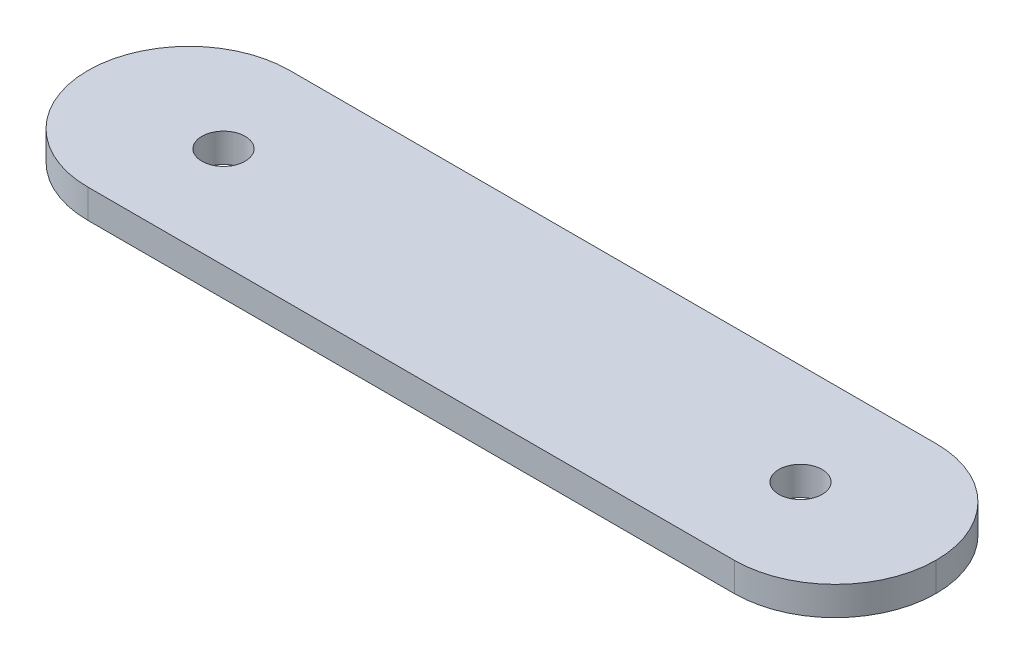
ISO-10303-21;
HEADER;
FILE_DESCRIPTION(('STEP AP214'),'2;1');
FILE_NAME('part.step','',(''),(''),'','','');
FILE_SCHEMA(('AUTOMOTIVE_DESIGN { 1 0 10303 214 1 1 1 1 }'));
ENDSEC;
DATA;
#1=APPLICATION_CONTEXT('core data for automotive mechanical design processes');
#2=APPLICATION_PROTOCOL_DEFINITION('international standard','automotive_design',2000,#1);
#3=PRODUCT_CONTEXT('',#1,'mechanical');
#4=PRODUCT('Part','Part','',(#3));
#5=PRODUCT_RELATED_PRODUCT_CATEGORY('part','',(#4));
#6=PRODUCT_DEFINITION_FORMATION('','',#4);
#7=PRODUCT_DEFINITION_CONTEXT('part definition',#1,'design');
#8=PRODUCT_DEFINITION('design','',#6,#7);
#9=PRODUCT_DEFINITION_SHAPE('','',#8);
#10=(LENGTH_UNIT() NAMED_UNIT(*) SI_UNIT(.MILLI.,.METRE.));
#11=(NAMED_UNIT(*) PLANE_ANGLE_UNIT() SI_UNIT($,.RADIAN.));
#12=(NAMED_UNIT(*) SI_UNIT($,.STERADIAN.) SOLID_ANGLE_UNIT());
#13=UNCERTAINTY_MEASURE_WITH_UNIT(LENGTH_MEASURE(1.E-05),#10,'distance_accuracy_value','');
#14=(GEOMETRIC_REPRESENTATION_CONTEXT(3) GLOBAL_UNCERTAINTY_ASSIGNED_CONTEXT((#13)) GLOBAL_UNIT_ASSIGNED_CONTEXT((#10,
#11,#12)) REPRESENTATION_CONTEXT('',''));
#15=CARTESIAN_POINT('',(0.,0.,0.));
#16=DIRECTION('',(0.,0.,1.));
#17=DIRECTION('',(1.,0.,0.));
#18=AXIS2_PLACEMENT_3D('',#15,#16,#17);
#19=CARTESIAN_POINT('',(101.316245321594,6.35,-4.00104230425884));
#20=DIRECTION('',(0.,1.,0.));
#21=DIRECTION('',(0.,0.,1.));
#22=AXIS2_PLACEMENT_3D('',#19,#20,#21);
#23=PLANE('',#22);
#24=CARTESIAN_POINT('',(-33.3291546784062,6.35,-4.02644230425883));
#25=DIRECTION('',(0.,1.,0.));
#26=DIRECTION('',(0.,0.,1.));
#27=AXIS2_PLACEMENT_3D('',#24,#25,#26);
#28=CIRCLE('',#27,4.7625);
#29=CARTESIAN_POINT('',(-33.3291546784062,6.35,0.73605769574117));
#30=VERTEX_POINT('',#29);
#31=EDGE_CURVE('E152',#30,#30,#28,.T.);
#32=ORIENTED_EDGE('',*,*,#31,.F.);
#33=EDGE_LOOP('',(#32));
#34=FACE_BOUND('',#33,.T.);
#35=CARTESIAN_POINT('',(101.316245321594,6.35,-4.00104230425884));
#36=DIRECTION('',(0.,1.,0.));
#37=DIRECTION('',(0.,0.,1.));
#38=AXIS2_PLACEMENT_3D('',#35,#36,#37);
#39=CIRCLE('',#38,22.1996);
#40=CARTESIAN_POINT('',(101.316245321594,6.35,18.1985576957412));
#41=VERTEX_POINT('',#40);
#42=CARTESIAN_POINT('',(123.515845321594,6.35,-4.001042304259));
#43=VERTEX_POINT('',#42);
#44=EDGE_CURVE('E170',#41,#43,#39,.T.);
#45=ORIENTED_EDGE('',*,*,#44,.T.);
#46=DIRECTION('',(0.,0.,-1.));
#47=VECTOR('',#46,1.);
#48=CARTESIAN_POINT('',(123.515845321594,6.35,-4.001042304259));
#49=LINE('',#48,#47);
#50=CARTESIAN_POINT('',(123.515845321594,6.35,-4.0518423042587));
#51=VERTEX_POINT('',#50);
#52=EDGE_CURVE('E106',#43,#51,#49,.T.);
#53=ORIENTED_EDGE('',*,*,#52,.T.);
#54=CARTESIAN_POINT('',(101.316245321594,6.35,-4.05184230425885));
#55=DIRECTION('',(0.,1.,0.));
#56=DIRECTION('',(0.,0.,-1.));
#57=AXIS2_PLACEMENT_3D('',#54,#55,#56);
#58=CIRCLE('',#57,22.1996);
#59=CARTESIAN_POINT('',(101.316245321594,6.35,-26.2514423042589));
#60=VERTEX_POINT('',#59);
#61=EDGE_CURVE('E191',#51,#60,#58,.T.);
#62=ORIENTED_EDGE('',*,*,#61,.T.);
#63=DIRECTION('',(-1.,0.,0.));
#64=VECTOR('',#63,1.);
#65=CARTESIAN_POINT('',(-40.974554678406,6.35,-26.2514423042589));
#66=LINE('',#65,#64);
#67=CARTESIAN_POINT('',(-40.9745546784062,6.35,-26.2514423042589));
#68=VERTEX_POINT('',#67);
#69=EDGE_CURVE('E205',#60,#68,#66,.T.);
#70=ORIENTED_EDGE('',*,*,#69,.T.);
#71=CARTESIAN_POINT('',(-40.9745546784062,6.35,-4.05184230425886));
#72=DIRECTION('',(0.,1.,0.));
#73=DIRECTION('',(0.,0.,-1.));
#74=AXIS2_PLACEMENT_3D('',#71,#72,#73);
#75=CIRCLE('',#74,22.1996);
#76=CARTESIAN_POINT('',(-63.1741546784062,6.35,-4.0518423042587));
#77=VERTEX_POINT('',#76);
#78=EDGE_CURVE('E125',#68,#77,#75,.T.);
#79=ORIENTED_EDGE('',*,*,#78,.T.);
#80=DIRECTION('',(0.,0.,1.));
#81=VECTOR('',#80,1.);
#82=CARTESIAN_POINT('',(-63.1741546784062,6.35,-4.001042304259));
#83=LINE('',#82,#81);
#84=CARTESIAN_POINT('',(-63.1741546784062,6.35,-4.00104230425899));
#85=VERTEX_POINT('',#84);
#86=EDGE_CURVE('E119',#77,#85,#83,.T.);
#87=ORIENTED_EDGE('',*,*,#86,.T.);
#88=CARTESIAN_POINT('',(-40.9745546784062,6.35,-4.00104230425884));
#89=DIRECTION('',(0.,1.,0.));
#90=DIRECTION('',(0.,0.,-1.));
#91=AXIS2_PLACEMENT_3D('',#88,#89,#90);
#92=CIRCLE('',#91,22.1996);
#93=CARTESIAN_POINT('',(-40.974554678406,6.35,18.1985576957412));
#94=VERTEX_POINT('',#93);
#95=EDGE_CURVE('E123',#85,#94,#92,.T.);
#96=ORIENTED_EDGE('',*,*,#95,.T.);
#97=DIRECTION('',(1.,0.,0.));
#98=VECTOR('',#97,1.);
#99=CARTESIAN_POINT('',(-40.974554678406,6.35,18.1985576957412));
#100=LINE('',#99,#98);
#101=EDGE_CURVE('E63',#94,#41,#100,.T.);
#102=ORIENTED_EDGE('',*,*,#101,.T.);
#103=EDGE_LOOP('',(#45,#53,#62,#70,#79,#87,#96,#102));
#104=FACE_BOUND('',#103,.T.);
#105=CARTESIAN_POINT('',(93.6708453215938,6.35,-4.02644230425885));
#106=DIRECTION('',(0.,1.,0.));
#107=DIRECTION('',(0.,0.,1.));
#108=AXIS2_PLACEMENT_3D('',#105,#106,#107);
#109=CIRCLE('',#108,4.7625);
#110=CARTESIAN_POINT('',(93.6708453215938,6.35,0.736057695741148));
#111=VERTEX_POINT('',#110);
#112=EDGE_CURVE('E219',#111,#111,#109,.T.);
#113=ORIENTED_EDGE('',*,*,#112,.F.);
#114=EDGE_LOOP('',(#113));
#115=FACE_BOUND('',#114,.T.);
#116=ADVANCED_FACE('F45',(#34,#104,#115),#23,.T.);
#117=CARTESIAN_POINT('',(101.316245321594,0.,-4.00104230425884));
#118=DIRECTION('',(0.,1.,0.));
#119=DIRECTION('',(0.,0.,1.));
#120=AXIS2_PLACEMENT_3D('',#117,#118,#119);
#121=PLANE('',#120);
#122=CARTESIAN_POINT('',(101.316245321594,0.,-4.00104230425884));
#123=DIRECTION('',(0.,1.,0.));
#124=DIRECTION('',(0.,0.,1.));
#125=AXIS2_PLACEMENT_3D('',#122,#123,#124);
#126=CIRCLE('',#125,22.1996);
#127=CARTESIAN_POINT('',(101.316245321594,0.,18.1985576957412));
#128=VERTEX_POINT('',#127);
#129=CARTESIAN_POINT('',(123.515845321594,0.,-4.001042304259));
#130=VERTEX_POINT('',#129);
#131=EDGE_CURVE('E147',#128,#130,#126,.T.);
#132=ORIENTED_EDGE('',*,*,#131,.F.);
#133=DIRECTION('',(1.,0.,0.));
#134=VECTOR('',#133,1.);
#135=CARTESIAN_POINT('',(-40.974554678406,0.,18.1985576957412));
#136=LINE('',#135,#134);
#137=CARTESIAN_POINT('',(-40.974554678406,0.,18.1985576957412));
#138=VERTEX_POINT('',#137);
#139=EDGE_CURVE('E98',#138,#128,#136,.T.);
#140=ORIENTED_EDGE('',*,*,#139,.F.);
#141=CARTESIAN_POINT('',(-40.9745546784062,0.,-4.00104230425884));
#142=DIRECTION('',(0.,1.,0.));
#143=DIRECTION('',(0.,0.,-1.));
#144=AXIS2_PLACEMENT_3D('',#141,#142,#143);
#145=CIRCLE('',#144,22.1996);
#146=CARTESIAN_POINT('',(-63.1741546784062,0.,-4.00104230425899));
#147=VERTEX_POINT('',#146);
#148=EDGE_CURVE('E92',#147,#138,#145,.T.);
#149=ORIENTED_EDGE('',*,*,#148,.F.);
#150=DIRECTION('',(0.,0.,1.));
#151=VECTOR('',#150,1.);
#152=CARTESIAN_POINT('',(-63.1741546784062,0.,-4.001042304259));
#153=LINE('',#152,#151);
#154=CARTESIAN_POINT('',(-63.1741546784062,0.,-4.0518423042587));
#155=VERTEX_POINT('',#154);
#156=EDGE_CURVE('E134',#155,#147,#153,.T.);
#157=ORIENTED_EDGE('',*,*,#156,.F.);
#158=CARTESIAN_POINT('',(-40.9745546784062,0.,-4.05184230425886));
#159=DIRECTION('',(0.,1.,0.));
#160=DIRECTION('',(0.,0.,-1.));
#161=AXIS2_PLACEMENT_3D('',#158,#159,#160);
#162=CIRCLE('',#161,22.1996);
#163=CARTESIAN_POINT('',(-40.9745546784062,0.,-26.2514423042589));
#164=VERTEX_POINT('',#163);
#165=EDGE_CURVE('E161',#164,#155,#162,.T.);
#166=ORIENTED_EDGE('',*,*,#165,.F.);
#167=DIRECTION('',(-1.,0.,0.));
#168=VECTOR('',#167,1.);
#169=CARTESIAN_POINT('',(-40.974554678406,0.,-26.2514423042589));
#170=LINE('',#169,#168);
#171=CARTESIAN_POINT('',(101.316245321594,0.,-26.2514423042589));
#172=VERTEX_POINT('',#171);
#173=EDGE_CURVE('E158',#172,#164,#170,.T.);
#174=ORIENTED_EDGE('',*,*,#173,.F.);
#175=CARTESIAN_POINT('',(101.316245321594,0.,-4.05184230425885));
#176=DIRECTION('',(0.,1.,0.));
#177=DIRECTION('',(0.,0.,-1.));
#178=AXIS2_PLACEMENT_3D('',#175,#176,#177);
#179=CIRCLE('',#178,22.1996);
#180=CARTESIAN_POINT('',(123.515845321594,0.,-4.0518423042587));
#181=VERTEX_POINT('',#180);
#182=EDGE_CURVE('E155',#181,#172,#179,.T.);
#183=ORIENTED_EDGE('',*,*,#182,.F.);
#184=DIRECTION('',(0.,0.,-1.));
#185=VECTOR('',#184,1.);
#186=CARTESIAN_POINT('',(123.515845321594,0.,-4.001042304259));
#187=LINE('',#186,#185);
#188=EDGE_CURVE('E151',#130,#181,#187,.T.);
#189=ORIENTED_EDGE('',*,*,#188,.F.);
#190=EDGE_LOOP('',(#132,#140,#149,#157,#166,#174,#183,#189));
#191=FACE_BOUND('',#190,.T.);
#192=CARTESIAN_POINT('',(-33.3291546784062,0.,-4.02644230425883));
#193=DIRECTION('',(0.,1.,0.));
#194=DIRECTION('',(0.,0.,1.));
#195=AXIS2_PLACEMENT_3D('',#192,#193,#194);
#196=CIRCLE('',#195,4.7625);
#197=CARTESIAN_POINT('',(-33.3291546784062,0.,0.73605769574117));
#198=VERTEX_POINT('',#197);
#199=EDGE_CURVE('E215',#198,#198,#196,.T.);
#200=ORIENTED_EDGE('',*,*,#199,.T.);
#201=EDGE_LOOP('',(#200));
#202=FACE_BOUND('',#201,.T.);
#203=CARTESIAN_POINT('',(93.6708453215938,0.,-4.02644230425885));
#204=DIRECTION('',(0.,1.,0.));
#205=DIRECTION('',(0.,0.,1.));
#206=AXIS2_PLACEMENT_3D('',#203,#204,#205);
#207=CIRCLE('',#206,4.7625);
#208=CARTESIAN_POINT('',(93.6708453215938,0.,0.736057695741148));
#209=VERTEX_POINT('',#208);
#210=EDGE_CURVE('E223',#209,#209,#207,.T.);
#211=ORIENTED_EDGE('',*,*,#210,.T.);
#212=EDGE_LOOP('',(#211));
#213=FACE_BOUND('',#212,.T.);
#214=ADVANCED_FACE('F195',(#191,#202,#213),#121,.F.);
#215=CARTESIAN_POINT('',(101.316245321594,6.35,-4.00104230425884));
#216=DIRECTION('',(0.,-1.,0.));
#217=DIRECTION('',(0.,0.,-1.));
#218=AXIS2_PLACEMENT_3D('',#215,#216,#217);
#219=CYLINDRICAL_SURFACE('',#218,22.1996);
#220=ORIENTED_EDGE('',*,*,#131,.T.);
#221=DIRECTION('',(0.,-1.,0.));
#222=VECTOR('',#221,1.);
#223=CARTESIAN_POINT('',(123.515845321594,6.35,-4.001042304259));
#224=LINE('',#223,#222);
#225=EDGE_CURVE('E11',#43,#130,#224,.T.);
#226=ORIENTED_EDGE('',*,*,#225,.F.);
#227=ORIENTED_EDGE('',*,*,#44,.F.);
#228=DIRECTION('',(0.,-1.,0.));
#229=VECTOR('',#228,1.);
#230=CARTESIAN_POINT('',(101.316245321594,6.35,18.1985576957412));
#231=LINE('',#230,#229);
#232=EDGE_CURVE('E143',#41,#128,#231,.T.);
#233=ORIENTED_EDGE('',*,*,#232,.T.);
#234=EDGE_LOOP('',(#220,#226,#227,#233));
#235=FACE_BOUND('',#234,.T.);
#236=ADVANCED_FACE('F47',(#235),#219,.T.);
#237=CARTESIAN_POINT('',(123.515845321594,6.35,-4.001042304259));
#238=DIRECTION('',(-1.,0.,0.));
#239=DIRECTION('',(0.,0.,1.));
#240=AXIS2_PLACEMENT_3D('',#237,#238,#239);
#241=PLANE('',#240);
#242=ORIENTED_EDGE('',*,*,#188,.T.);
#243=DIRECTION('',(0.,-1.,0.));
#244=VECTOR('',#243,1.);
#245=CARTESIAN_POINT('',(123.515845321594,6.35,-4.0518423042587));
#246=LINE('',#245,#244);
#247=EDGE_CURVE('E55',#51,#181,#246,.T.);
#248=ORIENTED_EDGE('',*,*,#247,.F.);
#249=ORIENTED_EDGE('',*,*,#52,.F.);
#250=ORIENTED_EDGE('',*,*,#225,.T.);
#251=EDGE_LOOP('',(#242,#248,#249,#250));
#252=FACE_BOUND('',#251,.T.);
#253=ADVANCED_FACE('F257',(#252),#241,.F.);
#254=CARTESIAN_POINT('',(101.316245321594,6.35,-4.05184230425885));
#255=DIRECTION('',(0.,-1.,0.));
#256=DIRECTION('',(0.,0.,-1.));
#257=AXIS2_PLACEMENT_3D('',#254,#255,#256);
#258=CYLINDRICAL_SURFACE('',#257,22.1996);
#259=ORIENTED_EDGE('',*,*,#182,.T.);
#260=DIRECTION('',(0.,-1.,0.));
#261=VECTOR('',#260,1.);
#262=CARTESIAN_POINT('',(101.316245321594,6.35,-26.2514423042589));
#263=LINE('',#262,#261);
#264=EDGE_CURVE('E181',#60,#172,#263,.T.);
#265=ORIENTED_EDGE('',*,*,#264,.F.);
#266=ORIENTED_EDGE('',*,*,#61,.F.);
#267=ORIENTED_EDGE('',*,*,#247,.T.);
#268=EDGE_LOOP('',(#259,#265,#266,#267));
#269=FACE_BOUND('',#268,.T.);
#270=ADVANCED_FACE('F189',(#269),#258,.T.);
#271=CARTESIAN_POINT('',(-40.974554678406,6.35,-26.2514423042589));
#272=DIRECTION('',(0.,0.,1.));
#273=DIRECTION('',(1.,0.,0.));
#274=AXIS2_PLACEMENT_3D('',#271,#272,#273);
#275=PLANE('',#274);
#276=ORIENTED_EDGE('',*,*,#173,.T.);
#277=DIRECTION('',(0.,-1.,0.));
#278=VECTOR('',#277,1.);
#279=CARTESIAN_POINT('',(-40.9745546784062,6.35,-26.2514423042589));
#280=LINE('',#279,#278);
#281=EDGE_CURVE('E177',#68,#164,#280,.T.);
#282=ORIENTED_EDGE('',*,*,#281,.F.);
#283=ORIENTED_EDGE('',*,*,#69,.F.);
#284=ORIENTED_EDGE('',*,*,#264,.T.);
#285=EDGE_LOOP('',(#276,#282,#283,#284));
#286=FACE_BOUND('',#285,.T.);
#287=ADVANCED_FACE('F200',(#286),#275,.F.);
#288=CARTESIAN_POINT('',(-40.9745546784062,6.35,-4.05184230425886));
#289=DIRECTION('',(0.,-1.,0.));
#290=DIRECTION('',(0.,0.,-1.));
#291=AXIS2_PLACEMENT_3D('',#288,#289,#290);
#292=CYLINDRICAL_SURFACE('',#291,22.1996);
#293=ORIENTED_EDGE('',*,*,#165,.T.);
#294=DIRECTION('',(0.,-1.,0.));
#295=VECTOR('',#294,1.);
#296=CARTESIAN_POINT('',(-63.1741546784062,6.35,-4.0518423042587));
#297=LINE('',#296,#295);
#298=EDGE_CURVE('E136',#77,#155,#297,.T.);
#299=ORIENTED_EDGE('',*,*,#298,.F.);
#300=ORIENTED_EDGE('',*,*,#78,.F.);
#301=ORIENTED_EDGE('',*,*,#281,.T.);
#302=EDGE_LOOP('',(#293,#299,#300,#301));
#303=FACE_BOUND('',#302,.T.);
#304=ADVANCED_FACE('F203',(#303),#292,.T.);
#305=CARTESIAN_POINT('',(-63.1741546784062,6.35,-4.001042304259));
#306=DIRECTION('',(1.,0.,0.));
#307=DIRECTION('',(0.,0.,-1.));
#308=AXIS2_PLACEMENT_3D('',#305,#306,#307);
#309=PLANE('',#308);
#310=ORIENTED_EDGE('',*,*,#156,.T.);
#311=DIRECTION('',(0.,-1.,0.));
#312=VECTOR('',#311,1.);
#313=CARTESIAN_POINT('',(-63.1741546784062,6.35,-4.00104230425899));
#314=LINE('',#313,#312);
#315=EDGE_CURVE('E131',#85,#147,#314,.T.);
#316=ORIENTED_EDGE('',*,*,#315,.F.);
#317=ORIENTED_EDGE('',*,*,#86,.F.);
#318=ORIENTED_EDGE('',*,*,#298,.T.);
#319=EDGE_LOOP('',(#310,#316,#317,#318));
#320=FACE_BOUND('',#319,.T.);
#321=ADVANCED_FACE('F132',(#320),#309,.F.);
#322=CARTESIAN_POINT('',(-40.9745546784062,6.35,-4.00104230425884));
#323=DIRECTION('',(0.,-1.,0.));
#324=DIRECTION('',(0.,0.,-1.));
#325=AXIS2_PLACEMENT_3D('',#322,#323,#324);
#326=CYLINDRICAL_SURFACE('',#325,22.1996);
#327=ORIENTED_EDGE('',*,*,#148,.T.);
#328=DIRECTION('',(0.,-1.,0.));
#329=VECTOR('',#328,1.);
#330=CARTESIAN_POINT('',(-40.974554678406,6.35,18.1985576957412));
#331=LINE('',#330,#329);
#332=EDGE_CURVE('E137',#94,#138,#331,.T.);
#333=ORIENTED_EDGE('',*,*,#332,.F.);
#334=ORIENTED_EDGE('',*,*,#95,.F.);
#335=ORIENTED_EDGE('',*,*,#315,.T.);
#336=EDGE_LOOP('',(#327,#333,#334,#335));
#337=FACE_BOUND('',#336,.T.);
#338=ADVANCED_FACE('F139',(#337),#326,.T.);
#339=CARTESIAN_POINT('',(-40.974554678406,6.35,18.1985576957412));
#340=DIRECTION('',(0.,0.,-1.));
#341=DIRECTION('',(-1.,0.,0.));
#342=AXIS2_PLACEMENT_3D('',#339,#340,#341);
#343=PLANE('',#342);
#344=ORIENTED_EDGE('',*,*,#139,.T.);
#345=ORIENTED_EDGE('',*,*,#232,.F.);
#346=ORIENTED_EDGE('',*,*,#101,.F.);
#347=ORIENTED_EDGE('',*,*,#332,.T.);
#348=EDGE_LOOP('',(#344,#345,#346,#347));
#349=FACE_BOUND('',#348,.T.);
#350=ADVANCED_FACE('F245',(#349),#343,.F.);
#351=CARTESIAN_POINT('',(-33.3291546784062,6.35,-4.02644230425883));
#352=DIRECTION('',(0.,-1.,0.));
#353=DIRECTION('',(0.,0.,-1.));
#354=AXIS2_PLACEMENT_3D('',#351,#352,#353);
#355=CYLINDRICAL_SURFACE('',#354,4.7625);
#356=ORIENTED_EDGE('',*,*,#31,.T.);
#357=EDGE_LOOP('',(#356));
#358=FACE_BOUND('',#357,.T.);
#359=ORIENTED_EDGE('',*,*,#199,.F.);
#360=EDGE_LOOP('',(#359));
#361=FACE_BOUND('',#360,.T.);
#362=ADVANCED_FACE('F242',(#358,#361),#355,.F.);
#363=CARTESIAN_POINT('',(93.6708453215938,6.35,-4.02644230425885));
#364=DIRECTION('',(0.,-1.,0.));
#365=DIRECTION('',(0.,0.,-1.));
#366=AXIS2_PLACEMENT_3D('',#363,#364,#365);
#367=CYLINDRICAL_SURFACE('',#366,4.7625);
#368=ORIENTED_EDGE('',*,*,#112,.T.);
#369=EDGE_LOOP('',(#368));
#370=FACE_BOUND('',#369,.T.);
#371=ORIENTED_EDGE('',*,*,#210,.F.);
#372=EDGE_LOOP('',(#371));
#373=FACE_BOUND('',#372,.T.);
#374=ADVANCED_FACE('F231',(#370,#373),#367,.F.);
#375=CLOSED_SHELL('',(#116,#214,#236,#253,#270,#287,#304,#321,#338,#350,#362,#374));
#376=MANIFOLD_SOLID_BREP('B2',#375);
#377=ADVANCED_BREP_SHAPE_REPRESENTATION('',(#18,#376),#14);
#378=SHAPE_DEFINITION_REPRESENTATION(#9,#377);
ENDSEC;
END-ISO-10303-21;
